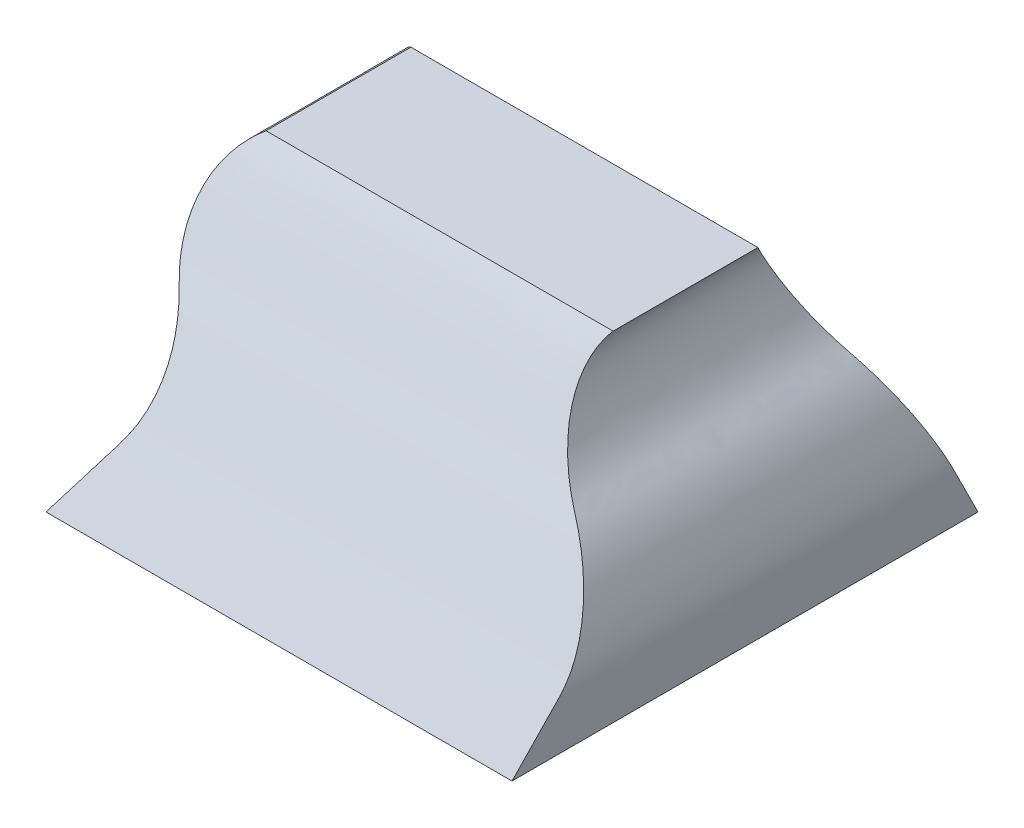
ISO-10303-21;
HEADER;
FILE_DESCRIPTION(('STEP AP214'),'2;1');
FILE_NAME('part.step','',(''),(''),'','','');
FILE_SCHEMA(('AUTOMOTIVE_DESIGN { 1 0 10303 214 1 1 1 1 }'));
ENDSEC;
DATA;
#1=APPLICATION_CONTEXT('core data for automotive mechanical design processes');
#2=APPLICATION_PROTOCOL_DEFINITION('international standard','automotive_design',2000,#1);
#3=PRODUCT_CONTEXT('',#1,'mechanical');
#4=PRODUCT('Part','Part','',(#3));
#5=PRODUCT_RELATED_PRODUCT_CATEGORY('part','',(#4));
#6=PRODUCT_DEFINITION_FORMATION('','',#4);
#7=PRODUCT_DEFINITION_CONTEXT('part definition',#1,'design');
#8=PRODUCT_DEFINITION('design','',#6,#7);
#9=PRODUCT_DEFINITION_SHAPE('','',#8);
#10=(LENGTH_UNIT() NAMED_UNIT(*) SI_UNIT(.MILLI.,.METRE.));
#11=(NAMED_UNIT(*) PLANE_ANGLE_UNIT() SI_UNIT($,.RADIAN.));
#12=(NAMED_UNIT(*) SI_UNIT($,.STERADIAN.) SOLID_ANGLE_UNIT());
#13=UNCERTAINTY_MEASURE_WITH_UNIT(LENGTH_MEASURE(1.E-05),#10,'distance_accuracy_value','');
#14=(GEOMETRIC_REPRESENTATION_CONTEXT(3) GLOBAL_UNCERTAINTY_ASSIGNED_CONTEXT((#13)) GLOBAL_UNIT_ASSIGNED_CONTEXT((#10,
#11,#12)) REPRESENTATION_CONTEXT('',''));
#15=CARTESIAN_POINT('',(0.,0.,0.));
#16=DIRECTION('',(0.,0.,1.));
#17=DIRECTION('',(1.,0.,0.));
#18=AXIS2_PLACEMENT_3D('',#15,#16,#17);
#19=CARTESIAN_POINT('',(0.,76.2,0.));
#20=DIRECTION('',(0.,-1.,0.));
#21=DIRECTION('',(0.,0.,-1.));
#22=AXIS2_PLACEMENT_3D('',#19,#20,#21);
#23=PLANE('',#22);
#24=DIRECTION('',(0.,0.,-1.));
#25=VECTOR('',#24,1.);
#26=CARTESIAN_POINT('',(47.2883286728717,76.2,19.7330995589805));
#27=LINE('',#26,#25);
#28=CARTESIAN_POINT('',(47.2883286728717,76.2,19.7330995589805));
#29=VERTEX_POINT('',#28);
#30=CARTESIAN_POINT('',(47.2883286728716,76.2,-19.7330995589805));
#31=VERTEX_POINT('',#30);
#32=EDGE_CURVE('E190',#29,#31,#27,.T.);
#33=ORIENTED_EDGE('',*,*,#32,.T.);
#34=DIRECTION('',(-1.,0.,0.));
#35=VECTOR('',#34,1.);
#36=CARTESIAN_POINT('',(-47.2883286728717,76.2,-19.7330995589805));
#37=LINE('',#36,#35);
#38=CARTESIAN_POINT('',(-47.2883286728717,76.2,-19.7330995589805));
#39=VERTEX_POINT('',#38);
#40=EDGE_CURVE('E301',#31,#39,#37,.T.);
#41=ORIENTED_EDGE('',*,*,#40,.T.);
#42=DIRECTION('',(0.,0.,1.));
#43=VECTOR('',#42,1.);
#44=CARTESIAN_POINT('',(-47.2883286728717,76.2,19.7330995589805));
#45=LINE('',#44,#43);
#46=CARTESIAN_POINT('',(-47.2883286728717,76.2,19.7330995589805));
#47=VERTEX_POINT('',#46);
#48=EDGE_CURVE('E125',#39,#47,#45,.T.);
#49=ORIENTED_EDGE('',*,*,#48,.T.);
#50=DIRECTION('',(1.,0.,0.));
#51=VECTOR('',#50,1.);
#52=CARTESIAN_POINT('',(-47.2883286728717,76.2,19.7330995589805));
#53=LINE('',#52,#51);
#54=EDGE_CURVE('E13',#47,#29,#53,.T.);
#55=ORIENTED_EDGE('',*,*,#54,.T.);
#56=EDGE_LOOP('',(#33,#41,#49,#55));
#57=FACE_BOUND('',#56,.T.);
#58=ADVANCED_FACE('F115',(#57),#23,.F.);
#59=CARTESIAN_POINT('',(0.,0.,0.));
#60=DIRECTION('',(0.,-1.,0.));
#61=DIRECTION('',(0.,0.,-1.));
#62=AXIS2_PLACEMENT_3D('',#59,#60,#61);
#63=PLANE('',#62);
#64=DIRECTION('',(0.,0.,-1.));
#65=VECTOR('',#64,1.);
#66=CARTESIAN_POINT('',(63.5,0.,63.5));
#67=LINE('',#66,#65);
#68=CARTESIAN_POINT('',(63.5,0.,63.5));
#69=VERTEX_POINT('',#68);
#70=CARTESIAN_POINT('',(63.5,0.,-63.5));
#71=VERTEX_POINT('',#70);
#72=EDGE_CURVE('E183',#69,#71,#67,.T.);
#73=ORIENTED_EDGE('',*,*,#72,.F.);
#74=DIRECTION('',(1.,0.,0.));
#75=VECTOR('',#74,1.);
#76=CARTESIAN_POINT('',(-63.5,0.,63.5));
#77=LINE('',#76,#75);
#78=CARTESIAN_POINT('',(-63.5,0.,63.5));
#79=VERTEX_POINT('',#78);
#80=EDGE_CURVE('E167',#79,#69,#77,.T.);
#81=ORIENTED_EDGE('',*,*,#80,.F.);
#82=DIRECTION('',(0.,0.,1.));
#83=VECTOR('',#82,1.);
#84=CARTESIAN_POINT('',(-63.5,0.,63.5));
#85=LINE('',#84,#83);
#86=CARTESIAN_POINT('',(-63.5,0.,-63.5));
#87=VERTEX_POINT('',#86);
#88=EDGE_CURVE('E158',#87,#79,#85,.T.);
#89=ORIENTED_EDGE('',*,*,#88,.F.);
#90=DIRECTION('',(-1.,0.,0.));
#91=VECTOR('',#90,1.);
#92=CARTESIAN_POINT('',(-63.5,0.,-63.5));
#93=LINE('',#92,#91);
#94=EDGE_CURVE('E163',#71,#87,#93,.T.);
#95=ORIENTED_EDGE('',*,*,#94,.F.);
#96=EDGE_LOOP('',(#73,#81,#89,#95));
#97=FACE_BOUND('',#96,.T.);
#98=ADVANCED_FACE('F162',(#97),#63,.T.);
#99=CARTESIAN_POINT('',(-63.5,0.,-63.5));
#100=CARTESIAN_POINT('',(-60.0339997252567,5.50398764821489,-60.2272015725901));
#101=CARTESIAN_POINT('',(-56.5679994505134,11.0079752964298,-56.9544031451802));
#102=CARTESIAN_POINT('',(-47.4277866830533,25.5225783507768,-48.3236842760795));
#103=CARTESIAN_POINT('',(-47.4277866830532,36.994862952167,-42.9657638343887));
#104=CARTESIAN_POINT('',(-59.4119780733157,56.0256870021544,-31.6495954481254));
#105=CARTESIAN_POINT('',(-56.8678475679443,69.2391643682091,-25.691347503553));
#106=CARTESIAN_POINT('',(-47.2883286728717,76.2,-19.7330995589805));
#107=CARTESIAN_POINT('',(-63.5,0.,-59.5657323127844));
#108=CARTESIAN_POINT('',(-60.0339997252567,5.50398764821489,-56.4105973824487));
#109=CARTESIAN_POINT('',(-56.5679994505134,11.0079752964298,-53.2554624521131));
#110=CARTESIAN_POINT('',(-47.4277866830533,25.5225783507768,-44.9350347869856));
#111=CARTESIAN_POINT('',(-47.4277866830532,36.994862952167,-39.7697420521938));
#112=CARTESIAN_POINT('',(-59.4119780733157,56.0256870021544,-28.8604120262331));
#113=CARTESIAN_POINT('',(-56.8678475679443,69.2391643682091,-23.1163747350643));
#114=CARTESIAN_POINT('',(-47.2883286728717,76.2,-17.3723374438954));
#115=CARTESIAN_POINT('',(-63.5,0.,-50.9478928675489));
#116=CARTESIAN_POINT('',(-60.0339997252566,5.50398764821489,-48.1720317325076));
#117=CARTESIAN_POINT('',(-56.5679994505133,11.0079752964298,-45.3961705974663));
#118=CARTESIAN_POINT('',(-47.4277866830532,25.5225783507768,-38.0759284231983));
#119=CARTESIAN_POINT('',(-47.4277866830531,36.994862952167,-33.5315473839715));
#120=CARTESIAN_POINT('',(-59.4119780733157,56.0256870021544,-23.93361071976));
#121=CARTESIAN_POINT('',(-56.8678475679443,69.2391643682091,-18.8800550947754));
#122=CARTESIAN_POINT('',(-47.2883286728717,76.2,-13.8264994697907));
#123=CARTESIAN_POINT('',(-63.5,0.,-35.1302914293915));
#124=CARTESIAN_POINT('',(-60.0339997252567,5.50398764821489,-33.1853292991606));
#125=CARTESIAN_POINT('',(-56.5679994505134,11.0079752964298,-31.2403671689296));
#126=CARTESIAN_POINT('',(-47.4277866830533,25.5225783507768,-26.111294380186));
#127=CARTESIAN_POINT('',(-47.4277866830532,36.994862952167,-22.9271837216733));
#128=CARTESIAN_POINT('',(-59.4119780733158,56.0256870021544,-16.2021991377564));
#129=CARTESIAN_POINT('',(-56.8678475679443,69.2391643682091,-12.661325212352));
#130=CARTESIAN_POINT('',(-47.2883286728717,76.2,-9.12045128694765));
#131=CARTESIAN_POINT('',(-63.5,0.,-16.8825657708556));
#132=CARTESIAN_POINT('',(-60.0339997252566,5.5039876482149,-15.9723754472763));
#133=CARTESIAN_POINT('',(-56.5679994505133,11.0079752964298,-15.062185123697));
#134=CARTESIAN_POINT('',(-47.4277866830532,25.5225783507768,-12.6619160651454));
#135=CARTESIAN_POINT('',(-47.4277866830531,36.994862952167,-11.171837330173));
#136=CARTESIAN_POINT('',(-59.4119780733157,56.0256870021545,-8.024724181099));
#137=CARTESIAN_POINT('',(-56.8678475679443,69.2391643682092,-6.36768976699737));
#138=CARTESIAN_POINT('',(-47.2883286728717,76.2000000000001,-4.71065535289574));
#139=CARTESIAN_POINT('',(-63.5,0.,-5.29166666666667));
#140=CARTESIAN_POINT('',(-60.0339997252567,5.50398764821489,-5.01893346438251));
#141=CARTESIAN_POINT('',(-56.5679994505134,11.0079752964298,-4.74620026209835));
#142=CARTESIAN_POINT('',(-47.4277866830533,25.5225783507768,-4.02697368967329));
#143=CARTESIAN_POINT('',(-47.4277866830532,36.994862952167,-3.58048031953239));
#144=CARTESIAN_POINT('',(-59.4119780733157,56.0256870021544,-2.63746628734378));
#145=CARTESIAN_POINT('',(-56.8678475679443,69.2391643682091,-2.14094562529608));
#146=CARTESIAN_POINT('',(-47.2883286728717,76.2,-1.64442496324837));
#147=CARTESIAN_POINT('',(-63.5,0.,5.29166666666667));
#148=CARTESIAN_POINT('',(-60.0339997252567,5.50398764821489,5.01893346438251));
#149=CARTESIAN_POINT('',(-56.5679994505134,11.0079752964298,4.74620026209835));
#150=CARTESIAN_POINT('',(-47.4277866830533,25.5225783507768,4.02697368967329));
#151=CARTESIAN_POINT('',(-47.4277866830532,36.994862952167,3.58048031953239));
#152=CARTESIAN_POINT('',(-59.4119780733157,56.0256870021544,2.63746628734379));
#153=CARTESIAN_POINT('',(-56.8678475679443,69.2391643682091,2.14094562529608));
#154=CARTESIAN_POINT('',(-47.2883286728717,76.2,1.64442496324839));
#155=CARTESIAN_POINT('',(-63.5,0.,16.8825657708555));
#156=CARTESIAN_POINT('',(-60.0339997252567,5.50398764821489,15.9723754472763));
#157=CARTESIAN_POINT('',(-56.5679994505133,11.0079752964298,15.062185123697));
#158=CARTESIAN_POINT('',(-47.4277866830533,25.5225783507768,12.6619160651454));
#159=CARTESIAN_POINT('',(-47.4277866830532,36.994862952167,11.171837330173));
#160=CARTESIAN_POINT('',(-59.4119780733158,56.0256870021544,8.024724181099));
#161=CARTESIAN_POINT('',(-56.8678475679443,69.2391643682091,6.36768976699738));
#162=CARTESIAN_POINT('',(-47.2883286728717,76.2,4.71065535289577));
#163=CARTESIAN_POINT('',(-63.5000000000001,0.,35.1302914293916));
#164=CARTESIAN_POINT('',(-60.0339997252567,5.50398764821489,33.1853292991606));
#165=CARTESIAN_POINT('',(-56.5679994505134,11.0079752964298,31.2403671689296));
#166=CARTESIAN_POINT('',(-47.4277866830533,25.5225783507768,26.111294380186));
#167=CARTESIAN_POINT('',(-47.4277866830532,36.994862952167,22.9271837216734));
#168=CARTESIAN_POINT('',(-59.4119780733157,56.0256870021544,16.2021991377564));
#169=CARTESIAN_POINT('',(-56.8678475679442,69.2391643682091,12.661325212352));
#170=CARTESIAN_POINT('',(-47.2883286728716,76.2,9.12045128694766));
#171=CARTESIAN_POINT('',(-63.5,0.,50.9478928675489));
#172=CARTESIAN_POINT('',(-60.0339997252567,5.5039876482149,48.1720317325076));
#173=CARTESIAN_POINT('',(-56.5679994505133,11.0079752964298,45.3961705974663));
#174=CARTESIAN_POINT('',(-47.4277866830532,25.5225783507768,38.0759284231983));
#175=CARTESIAN_POINT('',(-47.4277866830532,36.994862952167,33.5315473839715));
#176=CARTESIAN_POINT('',(-59.4119780733158,56.0256870021544,23.93361071976));
#177=CARTESIAN_POINT('',(-56.8678475679443,69.2391643682091,18.8800550947754));
#178=CARTESIAN_POINT('',(-47.2883286728717,76.2,13.8264994697907));
#179=CARTESIAN_POINT('',(-63.5,0.,59.5657323127844));
#180=CARTESIAN_POINT('',(-60.0339997252567,5.50398764821489,56.4105973824488));
#181=CARTESIAN_POINT('',(-56.5679994505134,11.0079752964298,53.2554624521131));
#182=CARTESIAN_POINT('',(-47.4277866830533,25.5225783507768,44.9350347869856));
#183=CARTESIAN_POINT('',(-47.4277866830532,36.994862952167,39.7697420521938));
#184=CARTESIAN_POINT('',(-59.4119780733157,56.0256870021544,28.8604120262332));
#185=CARTESIAN_POINT('',(-56.8678475679443,69.2391643682091,23.1163747350643));
#186=CARTESIAN_POINT('',(-47.2883286728717,76.2,17.3723374438954));
#187=CARTESIAN_POINT('',(-63.5,0.,63.5));
#188=CARTESIAN_POINT('',(-60.0339997252567,5.50398764821489,60.2272015725901));
#189=CARTESIAN_POINT('',(-56.5679994505133,11.0079752964298,56.9544031451802));
#190=CARTESIAN_POINT('',(-47.4277866830532,25.5225783507768,48.3236842760795));
#191=CARTESIAN_POINT('',(-47.4277866830531,36.994862952167,42.9657638343887));
#192=CARTESIAN_POINT('',(-59.4119780733157,56.0256870021544,31.6495954481254));
#193=CARTESIAN_POINT('',(-56.8678475679443,69.2391643682091,25.691347503553));
#194=CARTESIAN_POINT('',(-47.2883286728717,76.2,19.7330995589805));
#195=B_SPLINE_SURFACE_WITH_KNOTS('',3,3,((#99,#100,#101,#102,#103,#104,#105,#106),(#107,#108,
#109,#110,#111,#112,#113,#114),(#115,#116,#117,#118,#119,#120,#121,#122),(#123,#124,#125,#126,
#127,#128,#129,#130),(#131,#132,#133,#134,#135,#136,#137,#138),(#139,#140,#141,#142,#143,#144,
#145,#146),(#147,#148,#149,#150,#151,#152,#153,#154),(#155,#156,#157,#158,#159,#160,#161,#162),
(#163,#164,#165,#166,#167,#168,#169,#170),(#171,#172,#173,#174,#175,#176,#177,#178),(#179,#180,
#181,#182,#183,#184,#185,#186),(#187,#188,#189,#190,#191,#192,#193,#194)),.UNSPECIFIED.,.F.,.F.,
.F.,(4,1,1,1,2,1,1,1,4),(4,2,2,4),(0.801392572944296,0.826218501326259,0.851044429708222,
0.875870358090185,0.900696286472148,0.925522214854111,0.950348143236074,0.975174071618037,1.),
(0.,0.22433380438857,0.591592192876317,1.),.UNSPECIFIED.);
#196=CARTESIAN_POINT('',(-63.5,0.,63.5));
#197=CARTESIAN_POINT('',(-60.0339997252567,5.50398764821489,60.2272015725901));
#198=CARTESIAN_POINT('',(-56.5679994505133,11.0079752964298,56.9544031451802));
#199=CARTESIAN_POINT('',(-47.4277866830532,25.5225783507768,48.3236842760795));
#200=CARTESIAN_POINT('',(-47.4277866830531,36.994862952167,42.9657638343887));
#201=CARTESIAN_POINT('',(-59.4119780733157,56.0256870021544,31.6495954481254));
#202=CARTESIAN_POINT('',(-56.8678475679443,69.2391643682091,25.691347503553));
#203=CARTESIAN_POINT('',(-47.2883286728717,76.2,19.7330995589805));
#204=B_SPLINE_CURVE_WITH_KNOTS('',3,(#196,#197,#198,#199,#200,#201,#202,#203),.UNSPECIFIED.,.F.,
.F.,(4,2,2,4),(0.,0.22433380438857,0.591592192876317,1.),.UNSPECIFIED.);
#205=EDGE_CURVE('E140',#79,#47,#204,.T.);
#206=CARTESIAN_POINT('',(-63.5,0.,-63.5));
#207=CARTESIAN_POINT('',(-60.0339997252567,5.50398764821489,-60.2272015725901));
#208=CARTESIAN_POINT('',(-56.5679994505134,11.0079752964298,-56.9544031451802));
#209=CARTESIAN_POINT('',(-47.4277866830533,25.5225783507768,-48.3236842760795));
#210=CARTESIAN_POINT('',(-47.4277866830532,36.994862952167,-42.9657638343887));
#211=CARTESIAN_POINT('',(-59.4119780733157,56.0256870021544,-31.6495954481254));
#212=CARTESIAN_POINT('',(-56.8678475679443,69.2391643682091,-25.691347503553));
#213=CARTESIAN_POINT('',(-47.2883286728717,76.2,-19.7330995589805));
#214=B_SPLINE_CURVE_WITH_KNOTS('',3,(#206,#207,#208,#209,#210,#211,#212,#213),.UNSPECIFIED.,.F.,
.F.,(4,2,2,4),(0.,0.22433380438857,0.591592192876317,1.),.UNSPECIFIED.);
#215=EDGE_CURVE('E179',#87,#39,#214,.T.);
#216=ORIENTED_EDGE('',*,*,#88,.T.);
#217=ORIENTED_EDGE('',*,*,#205,.T.);
#218=ORIENTED_EDGE('',*,*,#48,.F.);
#219=ORIENTED_EDGE('',*,*,#215,.F.);
#220=EDGE_LOOP('',(#216,#217,#218,#219));
#221=FACE_BOUND('',#220,.T.);
#222=ADVANCED_FACE('F187',(#221),#195,.T.);
#223=CARTESIAN_POINT('',(63.5,0.,-63.5));
#224=CARTESIAN_POINT('',(64.5414496718688,5.50398764821489,-60.2272015725901));
#225=CARTESIAN_POINT('',(65.5828993437376,11.0079752964298,-56.9544031451802));
#226=CARTESIAN_POINT('',(68.3293133174604,25.5225783507768,-48.3236842760795));
#227=CARTESIAN_POINT('',(64.3600651265977,36.994862952167,-42.9657638343887));
#228=CARTESIAN_POINT('',(43.9926434544574,56.0256870021544,-31.6495954481254));
#229=CARTESIAN_POINT('',(42.1227918688139,69.2391643682091,-25.691347503553));
#230=CARTESIAN_POINT('',(47.2883286728716,76.2,-19.7330995589805));
#231=CARTESIAN_POINT('',(52.9166666666666,0.,-63.5));
#232=CARTESIAN_POINT('',(54.1601622221083,5.50398764821489,-60.2272015725901));
#233=CARTESIAN_POINT('',(55.40365777755,11.0079752964298,-56.9544031451802));
#234=CARTESIAN_POINT('',(58.6828883174176,25.5225783507768,-48.3236842760795));
#235=CARTESIAN_POINT('',(55.0444108091268,36.994862952167,-42.9657638343887));
#236=CARTESIAN_POINT('',(35.3755916604763,56.0256870021544,-31.6495954481254));
#237=CARTESIAN_POINT('',(33.8735719157507,69.2391643682091,-25.691347503553));
#238=CARTESIAN_POINT('',(39.4069405607263,76.2,-19.7330995589805));
#239=CARTESIAN_POINT('',(31.75,0.,-63.5000000000001));
#240=CARTESIAN_POINT('',(33.3975873225874,5.5039876482149,-60.2272015725902));
#241=CARTESIAN_POINT('',(35.0451746451749,11.0079752964298,-56.9544031451803));
#242=CARTESIAN_POINT('',(39.390038317332,25.5225783507768,-48.3236842760796));
#243=CARTESIAN_POINT('',(36.413102174185,36.994862952167,-42.9657638343888));
#244=CARTESIAN_POINT('',(18.1414880725142,56.0256870021545,-31.6495954481255));
#245=CARTESIAN_POINT('',(17.3751320096244,69.2391643682092,-25.691347503553));
#246=CARTESIAN_POINT('',(23.6441643364358,76.2000000000001,-19.7330995589806));
#247=CARTESIAN_POINT('',(0.,0.,-63.4999999999999));
#248=CARTESIAN_POINT('',(2.25372497330603,5.50398764821489,-60.22720157259));
#249=CARTESIAN_POINT('',(4.5074499466121,11.0079752964298,-56.9544031451801));
#250=CARTESIAN_POINT('',(10.4507633172036,25.5225783507768,-48.3236842760794));
#251=CARTESIAN_POINT('',(8.46613922177226,36.9948629521669,-42.9657638343886));
#252=CARTESIAN_POINT('',(-7.70966730942918,56.0256870021543,-31.6495954481254));
#253=CARTESIAN_POINT('',(-7.37252784956519,69.239164368209,-25.691347503553));
#254=CARTESIAN_POINT('',(0.,76.1999999999999,-19.7330995589805));
#255=CARTESIAN_POINT('',(-31.75,0.,-63.5000000000001));
#256=CARTESIAN_POINT('',(-28.8901373759753,5.5039876482149,-60.2272015725902));
#257=CARTESIAN_POINT('',(-26.0302747519506,11.0079752964298,-56.9544031451803));
#258=CARTESIAN_POINT('',(-18.4885116829248,25.5225783507768,-48.3236842760796));
#259=CARTESIAN_POINT('',(-19.4808237306404,36.994862952167,-42.9657638343888));
#260=CARTESIAN_POINT('',(-33.5608226913725,56.0256870021545,-31.6495954481255));
#261=CARTESIAN_POINT('',(-32.1201877087547,69.2391643682092,-25.691347503553));
#262=CARTESIAN_POINT('',(-23.6441643364358,76.2000000000001,-19.7330995589806));
#263=CARTESIAN_POINT('',(-52.9166666666667,0.,-63.5));
#264=CARTESIAN_POINT('',(-49.6527122754962,5.50398764821489,-60.2272015725901));
#265=CARTESIAN_POINT('',(-46.3887578843258,11.0079752964298,-56.9544031451802));
#266=CARTESIAN_POINT('',(-37.7813616830104,25.5225783507768,-48.3236842760795));
#267=CARTESIAN_POINT('',(-38.1121323655822,36.994862952167,-42.9657638343887));
#268=CARTESIAN_POINT('',(-50.7949262793346,56.0256870021544,-31.6495954481254));
#269=CARTESIAN_POINT('',(-48.6186276148811,69.2391643682091,-25.691347503553));
#270=CARTESIAN_POINT('',(-39.4069405607264,76.2,-19.7330995589805));
#271=CARTESIAN_POINT('',(-63.5,0.,-63.5));
#272=CARTESIAN_POINT('',(-60.0339997252567,5.50398764821489,-60.2272015725901));
#273=CARTESIAN_POINT('',(-56.5679994505134,11.0079752964298,-56.9544031451802));
#274=CARTESIAN_POINT('',(-47.4277866830533,25.5225783507768,-48.3236842760795));
#275=CARTESIAN_POINT('',(-47.4277866830532,36.994862952167,-42.9657638343887));
#276=CARTESIAN_POINT('',(-59.4119780733157,56.0256870021544,-31.6495954481254));
#277=CARTESIAN_POINT('',(-56.8678475679443,69.2391643682091,-25.691347503553));
#278=CARTESIAN_POINT('',(-47.2883286728717,76.2,-19.7330995589805));
#279=B_SPLINE_SURFACE_WITH_KNOTS('',3,3,((#223,#224,#225,#226,#227,#228,#229,#230),(#231,#232,
#233,#234,#235,#236,#237,#238),(#239,#240,#241,#242,#243,#244,#245,#246),(#247,#248,#249,#250,
#251,#252,#253,#254),(#255,#256,#257,#258,#259,#260,#261,#262),(#263,#264,#265,#266,#267,#268,
#269,#270),(#271,#272,#273,#274,#275,#276,#277,#278)),.UNSPECIFIED.,.F.,.F.,.F.,(4,1,1,1,4),(4,
2,2,4),(0.5,0.575348143236074,0.650696286472148,0.726044429708222,0.801392572944296),(0.,
0.22433380438857,0.591592192876317,1.),.UNSPECIFIED.);
#280=CARTESIAN_POINT('',(63.5,0.,-63.5));
#281=CARTESIAN_POINT('',(64.5414496718688,5.50398764821489,-60.2272015725901));
#282=CARTESIAN_POINT('',(65.5828993437376,11.0079752964298,-56.9544031451802));
#283=CARTESIAN_POINT('',(68.3293133174604,25.5225783507768,-48.3236842760795));
#284=CARTESIAN_POINT('',(64.3600651265977,36.994862952167,-42.9657638343887));
#285=CARTESIAN_POINT('',(43.9926434544574,56.0256870021544,-31.6495954481254));
#286=CARTESIAN_POINT('',(42.1227918688139,69.2391643682091,-25.691347503553));
#287=CARTESIAN_POINT('',(47.2883286728716,76.2,-19.7330995589805));
#288=B_SPLINE_CURVE_WITH_KNOTS('',3,(#280,#281,#282,#283,#284,#285,#286,#287),.UNSPECIFIED.,.F.,
.F.,(4,2,2,4),(0.,0.22433380438857,0.591592192876317,1.),.UNSPECIFIED.);
#289=EDGE_CURVE('E182',#71,#31,#288,.T.);
#290=ORIENTED_EDGE('',*,*,#94,.T.);
#291=ORIENTED_EDGE('',*,*,#215,.T.);
#292=ORIENTED_EDGE('',*,*,#40,.F.);
#293=ORIENTED_EDGE('',*,*,#289,.F.);
#294=EDGE_LOOP('',(#290,#291,#292,#293));
#295=FACE_BOUND('',#294,.T.);
#296=ADVANCED_FACE('F178',(#295),#279,.T.);
#297=CARTESIAN_POINT('',(63.5,0.,63.5));
#298=CARTESIAN_POINT('',(64.5414496718688,5.50398764821489,60.2272015725901));
#299=CARTESIAN_POINT('',(65.5828993437376,11.0079752964298,56.9544031451803));
#300=CARTESIAN_POINT('',(68.3293133174604,25.5225783507768,48.3236842760795));
#301=CARTESIAN_POINT('',(64.3600651265977,36.994862952167,42.9657638343887));
#302=CARTESIAN_POINT('',(43.9926434544574,56.0256870021544,31.6495954481254));
#303=CARTESIAN_POINT('',(42.122791868814,69.2391643682091,25.691347503553));
#304=CARTESIAN_POINT('',(47.2883286728717,76.2,19.7330995589805));
#305=CARTESIAN_POINT('',(63.5,0.,52.9166666666667));
#306=CARTESIAN_POINT('',(64.5414496718688,5.50398764821489,50.1893346438251));
#307=CARTESIAN_POINT('',(65.5828993437376,11.0079752964298,47.4620026209835));
#308=CARTESIAN_POINT('',(68.3293133174604,25.5225783507768,40.2697368967329));
#309=CARTESIAN_POINT('',(64.3600651265977,36.994862952167,35.8048031953239));
#310=CARTESIAN_POINT('',(43.9926434544574,56.0256870021544,26.3746628734379));
#311=CARTESIAN_POINT('',(42.122791868814,69.2391643682091,21.4094562529608));
#312=CARTESIAN_POINT('',(47.2883286728717,76.2,16.4442496324838));
#313=CARTESIAN_POINT('',(63.5,0.,31.75));
#314=CARTESIAN_POINT('',(64.5414496718688,5.5039876482149,30.1136007862951));
#315=CARTESIAN_POINT('',(65.5828993437376,11.0079752964298,28.4772015725901));
#316=CARTESIAN_POINT('',(68.3293133174604,25.5225783507768,24.1618421380398));
#317=CARTESIAN_POINT('',(64.3600651265977,36.994862952167,21.4828819171943));
#318=CARTESIAN_POINT('',(43.9926434544575,56.0256870021545,15.8247977240627));
#319=CARTESIAN_POINT('',(42.122791868814,69.2391643682092,12.8456737517765));
#320=CARTESIAN_POINT('',(47.2883286728717,76.2000000000001,9.86654977949028));
#321=CARTESIAN_POINT('',(63.5,0.,0.));
#322=CARTESIAN_POINT('',(64.5414496718688,5.50398764821489,0.));
#323=CARTESIAN_POINT('',(65.5828993437376,11.0079752964298,0.));
#324=CARTESIAN_POINT('',(68.3293133174604,25.5225783507768,0.));
#325=CARTESIAN_POINT('',(64.3600651265977,36.994862952167,0.));
#326=CARTESIAN_POINT('',(43.9926434544574,56.0256870021544,0.));
#327=CARTESIAN_POINT('',(42.1227918688139,69.2391643682091,0.));
#328=CARTESIAN_POINT('',(47.2883286728716,76.2,0.));
#329=CARTESIAN_POINT('',(63.4999999999999,0.,-31.75));
#330=CARTESIAN_POINT('',(64.5414496718687,5.50398764821489,-30.113600786295));
#331=CARTESIAN_POINT('',(65.5828993437375,11.0079752964298,-28.4772015725901));
#332=CARTESIAN_POINT('',(68.3293133174604,25.5225783507768,-24.1618421380397));
#333=CARTESIAN_POINT('',(64.3600651265977,36.994862952167,-21.4828819171943));
#334=CARTESIAN_POINT('',(43.9926434544574,56.0256870021544,-15.8247977240627));
#335=CARTESIAN_POINT('',(42.122791868814,69.2391643682091,-12.8456737517765));
#336=CARTESIAN_POINT('',(47.2883286728717,76.2,-9.86654977949026));
#337=CARTESIAN_POINT('',(63.5,0.,-52.9166666666667));
#338=CARTESIAN_POINT('',(64.5414496718688,5.50398764821489,-50.1893346438251));
#339=CARTESIAN_POINT('',(65.5828993437376,11.0079752964298,-47.4620026209835));
#340=CARTESIAN_POINT('',(68.3293133174604,25.5225783507768,-40.2697368967329));
#341=CARTESIAN_POINT('',(64.3600651265977,36.994862952167,-35.8048031953239));
#342=CARTESIAN_POINT('',(43.9926434544574,56.0256870021544,-26.3746628734378));
#343=CARTESIAN_POINT('',(42.122791868814,69.2391643682091,-21.4094562529608));
#344=CARTESIAN_POINT('',(47.2883286728717,76.2,-16.4442496324838));
#345=CARTESIAN_POINT('',(63.5,0.,-63.5));
#346=CARTESIAN_POINT('',(64.5414496718688,5.50398764821489,-60.2272015725901));
#347=CARTESIAN_POINT('',(65.5828993437376,11.0079752964298,-56.9544031451802));
#348=CARTESIAN_POINT('',(68.3293133174604,25.5225783507768,-48.3236842760795));
#349=CARTESIAN_POINT('',(64.3600651265977,36.994862952167,-42.9657638343887));
#350=CARTESIAN_POINT('',(43.9926434544574,56.0256870021544,-31.6495954481254));
#351=CARTESIAN_POINT('',(42.1227918688139,69.2391643682091,-25.691347503553));
#352=CARTESIAN_POINT('',(47.2883286728716,76.2,-19.7330995589805));
#353=B_SPLINE_SURFACE_WITH_KNOTS('',3,3,((#297,#298,#299,#300,#301,#302,#303,#304),(#305,#306,
#307,#308,#309,#310,#311,#312),(#313,#314,#315,#316,#317,#318,#319,#320),(#321,#322,#323,#324,
#325,#326,#327,#328),(#329,#330,#331,#332,#333,#334,#335,#336),(#337,#338,#339,#340,#341,#342,
#343,#344),(#345,#346,#347,#348,#349,#350,#351,#352)),.UNSPECIFIED.,.F.,.F.,.F.,(4,1,1,1,4),(4,
2,2,4),(0.301392572944296,0.351044429708222,0.400696286472148,0.450348143236074,0.5),(0.,
0.22433380438857,0.591592192876317,1.),.UNSPECIFIED.);
#354=CARTESIAN_POINT('',(63.5,0.,63.5));
#355=CARTESIAN_POINT('',(64.5414496718688,5.50398764821489,60.2272015725901));
#356=CARTESIAN_POINT('',(65.5828993437376,11.0079752964298,56.9544031451803));
#357=CARTESIAN_POINT('',(68.3293133174604,25.5225783507768,48.3236842760795));
#358=CARTESIAN_POINT('',(64.3600651265977,36.994862952167,42.9657638343887));
#359=CARTESIAN_POINT('',(43.9926434544574,56.0256870021544,31.6495954481254));
#360=CARTESIAN_POINT('',(42.122791868814,69.2391643682091,25.691347503553));
#361=CARTESIAN_POINT('',(47.2883286728717,76.2,19.7330995589805));
#362=B_SPLINE_CURVE_WITH_KNOTS('',3,(#354,#355,#356,#357,#358,#359,#360,#361),.UNSPECIFIED.,.F.,
.F.,(4,2,2,4),(0.,0.22433380438857,0.591592192876317,1.),.UNSPECIFIED.);
#363=EDGE_CURVE('E192',#69,#29,#362,.T.);
#364=ORIENTED_EDGE('',*,*,#72,.T.);
#365=ORIENTED_EDGE('',*,*,#289,.T.);
#366=ORIENTED_EDGE('',*,*,#32,.F.);
#367=ORIENTED_EDGE('',*,*,#363,.F.);
#368=EDGE_LOOP('',(#364,#365,#366,#367));
#369=FACE_BOUND('',#368,.T.);
#370=ADVANCED_FACE('F319',(#369),#353,.T.);
#371=CARTESIAN_POINT('',(-63.5,0.,63.5));
#372=CARTESIAN_POINT('',(-60.0339997252567,5.50398764821489,60.2272015725901));
#373=CARTESIAN_POINT('',(-56.5679994505133,11.0079752964298,56.9544031451802));
#374=CARTESIAN_POINT('',(-47.4277866830532,25.5225783507768,48.3236842760795));
#375=CARTESIAN_POINT('',(-47.4277866830531,36.994862952167,42.9657638343887));
#376=CARTESIAN_POINT('',(-59.4119780733157,56.0256870021544,31.6495954481254));
#377=CARTESIAN_POINT('',(-56.8678475679443,69.2391643682091,25.691347503553));
#378=CARTESIAN_POINT('',(-47.2883286728717,76.2,19.7330995589805));
#379=CARTESIAN_POINT('',(-52.9166666666667,0.,63.5));
#380=CARTESIAN_POINT('',(-49.6527122754962,5.50398764821489,60.2272015725901));
#381=CARTESIAN_POINT('',(-46.3887578843258,11.0079752964298,56.9544031451802));
#382=CARTESIAN_POINT('',(-37.7813616830104,25.5225783507768,48.3236842760795));
#383=CARTESIAN_POINT('',(-38.1121323655822,36.994862952167,42.9657638343887));
#384=CARTESIAN_POINT('',(-50.7949262793346,56.0256870021544,31.6495954481254));
#385=CARTESIAN_POINT('',(-48.6186276148811,69.2391643682091,25.691347503553));
#386=CARTESIAN_POINT('',(-39.4069405607264,76.2,19.7330995589805));
#387=CARTESIAN_POINT('',(-31.75,0.,63.5000000000001));
#388=CARTESIAN_POINT('',(-28.8901373759753,5.5039876482149,60.2272015725902));
#389=CARTESIAN_POINT('',(-26.0302747519506,11.0079752964298,56.9544031451803));
#390=CARTESIAN_POINT('',(-18.4885116829248,25.5225783507768,48.3236842760796));
#391=CARTESIAN_POINT('',(-19.4808237306404,36.994862952167,42.9657638343888));
#392=CARTESIAN_POINT('',(-33.5608226913725,56.0256870021545,31.6495954481255));
#393=CARTESIAN_POINT('',(-32.1201877087547,69.2391643682092,25.691347503553));
#394=CARTESIAN_POINT('',(-23.6441643364359,76.2000000000002,19.7330995589806));
#395=CARTESIAN_POINT('',(0.,0.,63.5));
#396=CARTESIAN_POINT('',(2.25372497330605,5.50398764821488,60.2272015725901));
#397=CARTESIAN_POINT('',(4.50744994661212,11.0079752964298,56.9544031451802));
#398=CARTESIAN_POINT('',(10.4507633172036,25.5225783507767,48.3236842760795));
#399=CARTESIAN_POINT('',(8.46613922177228,36.9948629521669,42.9657638343887));
#400=CARTESIAN_POINT('',(-7.70966730942916,56.0256870021543,31.6495954481254));
#401=CARTESIAN_POINT('',(-7.37252784956517,69.2391643682089,25.691347503553));
#402=CARTESIAN_POINT('',(0.,76.1999999999998,19.7330995589805));
#403=CARTESIAN_POINT('',(31.75,0.,63.5000000000001));
#404=CARTESIAN_POINT('',(33.3975873225874,5.50398764821491,60.2272015725902));
#405=CARTESIAN_POINT('',(35.0451746451749,11.0079752964298,56.9544031451803));
#406=CARTESIAN_POINT('',(39.390038317332,25.5225783507769,48.3236842760796));
#407=CARTESIAN_POINT('',(36.413102174185,36.994862952167,42.9657638343887));
#408=CARTESIAN_POINT('',(18.1414880725141,56.0256870021545,31.6495954481255));
#409=CARTESIAN_POINT('',(17.3751320096244,69.2391643682093,25.691347503553));
#410=CARTESIAN_POINT('',(23.6441643364358,76.2000000000002,19.7330995589806));
#411=CARTESIAN_POINT('',(52.9166666666666,0.,63.5));
#412=CARTESIAN_POINT('',(54.1601622221083,5.50398764821489,60.2272015725901));
#413=CARTESIAN_POINT('',(55.40365777755,11.0079752964298,56.9544031451802));
#414=CARTESIAN_POINT('',(58.6828883174176,25.5225783507768,48.3236842760795));
#415=CARTESIAN_POINT('',(55.0444108091268,36.994862952167,42.9657638343887));
#416=CARTESIAN_POINT('',(35.3755916604763,56.0256870021544,31.6495954481254));
#417=CARTESIAN_POINT('',(33.8735719157507,69.2391643682091,25.691347503553));
#418=CARTESIAN_POINT('',(39.4069405607263,76.2,19.7330995589805));
#419=CARTESIAN_POINT('',(63.5,0.,63.5));
#420=CARTESIAN_POINT('',(64.5414496718688,5.50398764821489,60.2272015725901));
#421=CARTESIAN_POINT('',(65.5828993437376,11.0079752964298,56.9544031451803));
#422=CARTESIAN_POINT('',(68.3293133174604,25.5225783507768,48.3236842760795));
#423=CARTESIAN_POINT('',(64.3600651265977,36.994862952167,42.9657638343887));
#424=CARTESIAN_POINT('',(43.9926434544574,56.0256870021544,31.6495954481254));
#425=CARTESIAN_POINT('',(42.122791868814,69.2391643682091,25.691347503553));
#426=CARTESIAN_POINT('',(47.2883286728717,76.2,19.7330995589805));
#427=B_SPLINE_SURFACE_WITH_KNOTS('',3,3,((#371,#372,#373,#374,#375,#376,#377,#378),(#379,#380,
#381,#382,#383,#384,#385,#386),(#387,#388,#389,#390,#391,#392,#393,#394),(#395,#396,#397,#398,
#399,#400,#401,#402),(#403,#404,#405,#406,#407,#408,#409,#410),(#411,#412,#413,#414,#415,#416,
#417,#418),(#419,#420,#421,#422,#423,#424,#425,#426)),.UNSPECIFIED.,.F.,.F.,.F.,(4,1,1,1,4),(4,
2,2,4),(0.,0.0753481432360741,0.150696286472148,0.226044429708222,0.301392572944296),(0.,
0.22433380438857,0.591592192876317,1.),.UNSPECIFIED.);
#428=ORIENTED_EDGE('',*,*,#80,.T.);
#429=ORIENTED_EDGE('',*,*,#363,.T.);
#430=ORIENTED_EDGE('',*,*,#54,.F.);
#431=ORIENTED_EDGE('',*,*,#205,.F.);
#432=EDGE_LOOP('',(#428,#429,#430,#431));
#433=FACE_BOUND('',#432,.T.);
#434=ADVANCED_FACE('F261',(#433),#427,.T.);
#435=CLOSED_SHELL('',(#58,#98,#222,#296,#370,#434));
#436=MANIFOLD_SOLID_BREP('B2',#435);
#437=ADVANCED_BREP_SHAPE_REPRESENTATION('',(#18,#436),#14);
#438=SHAPE_DEFINITION_REPRESENTATION(#9,#437);
ENDSEC;
END-ISO-10303-21;
